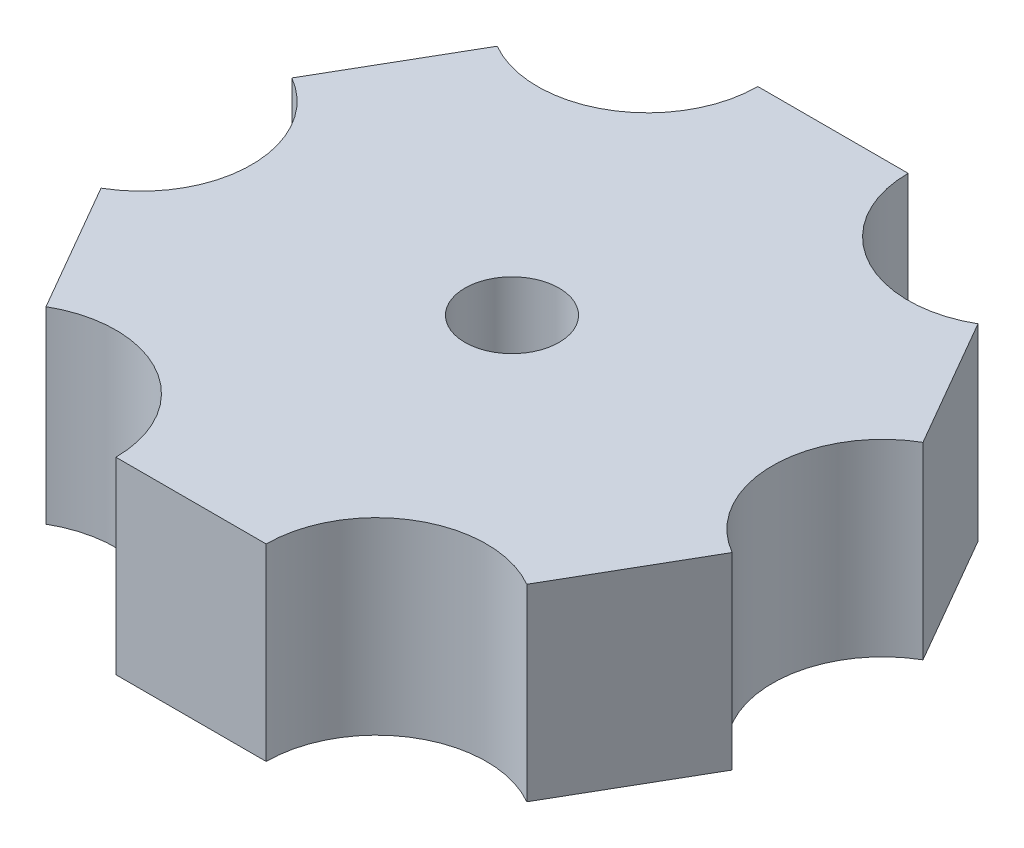
ISO-10303-21;
HEADER;
FILE_DESCRIPTION(('STEP AP214'),'2;1');
FILE_NAME('part.step','',(''),(''),'','','');
FILE_SCHEMA(('AUTOMOTIVE_DESIGN { 1 0 10303 214 1 1 1 1 }'));
ENDSEC;
DATA;
#1=APPLICATION_CONTEXT('core data for automotive mechanical design processes');
#2=APPLICATION_PROTOCOL_DEFINITION('international standard','automotive_design',2000,#1);
#3=PRODUCT_CONTEXT('',#1,'mechanical');
#4=PRODUCT('Part','Part','',(#3));
#5=PRODUCT_RELATED_PRODUCT_CATEGORY('part','',(#4));
#6=PRODUCT_DEFINITION_FORMATION('','',#4);
#7=PRODUCT_DEFINITION_CONTEXT('part definition',#1,'design');
#8=PRODUCT_DEFINITION('design','',#6,#7);
#9=PRODUCT_DEFINITION_SHAPE('','',#8);
#10=(LENGTH_UNIT() NAMED_UNIT(*) SI_UNIT(.MILLI.,.METRE.));
#11=(NAMED_UNIT(*) PLANE_ANGLE_UNIT() SI_UNIT($,.RADIAN.));
#12=(NAMED_UNIT(*) SI_UNIT($,.STERADIAN.) SOLID_ANGLE_UNIT());
#13=UNCERTAINTY_MEASURE_WITH_UNIT(LENGTH_MEASURE(1.E-05),#10,'distance_accuracy_value','');
#14=(GEOMETRIC_REPRESENTATION_CONTEXT(3) GLOBAL_UNCERTAINTY_ASSIGNED_CONTEXT((#13)) GLOBAL_UNIT_ASSIGNED_CONTEXT((#10,
#11,#12)) REPRESENTATION_CONTEXT('',''));
#15=CARTESIAN_POINT('',(0.,0.,0.));
#16=DIRECTION('',(0.,0.,1.));
#17=DIRECTION('',(1.,0.,0.));
#18=AXIS2_PLACEMENT_3D('',#15,#16,#17);
#19=CARTESIAN_POINT('',(-19.6750369171363,20.,-34.0781635812735));
#20=DIRECTION('',(0.,-1.,0.));
#21=DIRECTION('',(0.,0.,-1.));
#22=AXIS2_PLACEMENT_3D('',#19,#20,#21);
#23=PLANE('',#22);
#24=CARTESIAN_POINT('',(-19.6750369171363,20.,-34.0781635812735));
#25=DIRECTION('',(0.,-1.,0.));
#26=DIRECTION('',(0.,0.,-1.));
#27=AXIS2_PLACEMENT_3D('',#24,#25,#26);
#28=CIRCLE('',#27,11.6951392406016);
#29=CARTESIAN_POINT('',(-7.97989767653467,20.,-34.0781635812735));
#30=VERTEX_POINT('',#29);
#31=CARTESIAN_POINT('',(-25.5226065374371,20.,-23.9498758981163));
#32=VERTEX_POINT('',#31);
#33=EDGE_CURVE('E178',#30,#32,#28,.T.);
#34=ORIENTED_EDGE('',*,*,#33,.T.);
#35=DIRECTION('',(-0.500000000000004,0.,0.866025403784436));
#36=VECTOR('',#35,1.);
#37=CARTESIAN_POINT('',(-25.5226065374371,20.,-23.9498758981163));
#38=LINE('',#37,#36);
#39=CARTESIAN_POINT('',(-33.5025042139718,20.,-10.1282876831575));
#40=VERTEX_POINT('',#39);
#41=EDGE_CURVE('E106',#32,#40,#38,.T.);
#42=ORIENTED_EDGE('',*,*,#41,.T.);
#43=CARTESIAN_POINT('',(-39.3500738342727,20.,-2.91693635925226E-13));
#44=DIRECTION('',(0.,-1.,0.));
#45=DIRECTION('',(0.,0.,1.));
#46=AXIS2_PLACEMENT_3D('',#43,#44,#45);
#47=CIRCLE('',#46,11.6951392406016);
#48=CARTESIAN_POINT('',(-33.502504213972,20.,10.128287683157));
#49=VERTEX_POINT('',#48);
#50=EDGE_CURVE('E205',#40,#49,#47,.T.);
#51=ORIENTED_EDGE('',*,*,#50,.T.);
#52=DIRECTION('',(0.499999999999991,0.,0.866025403784444));
#53=VECTOR('',#52,1.);
#54=CARTESIAN_POINT('',(-33.502504213972,20.,10.128287683157));
#55=LINE('',#54,#53);
#56=CARTESIAN_POINT('',(-25.5226065374374,20.,23.9498758981159));
#57=VERTEX_POINT('',#56);
#58=EDGE_CURVE('E224',#49,#57,#55,.T.);
#59=ORIENTED_EDGE('',*,*,#58,.T.);
#60=CARTESIAN_POINT('',(-19.6750369171366,20.,34.0781635812735));
#61=DIRECTION('',(0.,-1.,0.));
#62=DIRECTION('',(0.,0.,1.));
#63=AXIS2_PLACEMENT_3D('',#60,#61,#62);
#64=CIRCLE('',#63,11.6951392406019);
#65=CARTESIAN_POINT('',(-7.97989767653468,20.,34.0781635812735));
#66=VERTEX_POINT('',#65);
#67=EDGE_CURVE('E221',#57,#66,#64,.T.);
#68=ORIENTED_EDGE('',*,*,#67,.T.);
#69=DIRECTION('',(1.,0.,0.));
#70=VECTOR('',#69,1.);
#71=CARTESIAN_POINT('',(7.97989767653467,20.,34.0781635812735));
#72=LINE('',#71,#70);
#73=CARTESIAN_POINT('',(7.97989767653467,20.,34.0781635812735));
#74=VERTEX_POINT('',#73);
#75=EDGE_CURVE('E223',#66,#74,#72,.T.);
#76=ORIENTED_EDGE('',*,*,#75,.T.);
#77=CARTESIAN_POINT('',(19.6750369171366,20.,34.0781635812735));
#78=DIRECTION('',(0.,-1.,0.));
#79=DIRECTION('',(0.,0.,-1.));
#80=AXIS2_PLACEMENT_3D('',#77,#78,#79);
#81=CIRCLE('',#80,11.6951392406019);
#82=CARTESIAN_POINT('',(25.5226065374374,20.,23.949875898116));
#83=VERTEX_POINT('',#82);
#84=EDGE_CURVE('E226',#74,#83,#81,.T.);
#85=ORIENTED_EDGE('',*,*,#84,.T.);
#86=DIRECTION('',(0.499999999999991,0.,-0.866025403784444));
#87=VECTOR('',#86,1.);
#88=CARTESIAN_POINT('',(33.502504213972,20.,10.128287683157));
#89=LINE('',#88,#87);
#90=CARTESIAN_POINT('',(33.502504213972,20.,10.128287683157));
#91=VERTEX_POINT('',#90);
#92=EDGE_CURVE('E232',#83,#91,#89,.T.);
#93=ORIENTED_EDGE('',*,*,#92,.T.);
#94=CARTESIAN_POINT('',(39.3500738342727,20.,-2.82055647531755E-13));
#95=DIRECTION('',(0.,-1.,0.));
#96=DIRECTION('',(0.,0.,-1.));
#97=AXIS2_PLACEMENT_3D('',#94,#95,#96);
#98=CIRCLE('',#97,11.6951392406016);
#99=CARTESIAN_POINT('',(33.5025042139718,20.,-10.1282876831575));
#100=VERTEX_POINT('',#99);
#101=EDGE_CURVE('E137',#91,#100,#98,.T.);
#102=ORIENTED_EDGE('',*,*,#101,.T.);
#103=DIRECTION('',(-0.500000000000004,0.,-0.866025403784436));
#104=VECTOR('',#103,1.);
#105=CARTESIAN_POINT('',(25.5226065374371,20.,-23.9498758981163));
#106=LINE('',#105,#104);
#107=CARTESIAN_POINT('',(25.5226065374371,20.,-23.9498758981163));
#108=VERTEX_POINT('',#107);
#109=EDGE_CURVE('E131',#100,#108,#106,.T.);
#110=ORIENTED_EDGE('',*,*,#109,.T.);
#111=CARTESIAN_POINT('',(19.6750369171363,20.,-34.0781635812735));
#112=DIRECTION('',(0.,-1.,0.));
#113=DIRECTION('',(0.,0.,1.));
#114=AXIS2_PLACEMENT_3D('',#111,#112,#113);
#115=CIRCLE('',#114,11.6951392406016);
#116=CARTESIAN_POINT('',(7.97989767653468,20.,-34.0781635812735));
#117=VERTEX_POINT('',#116);
#118=EDGE_CURVE('E135',#108,#117,#115,.T.);
#119=ORIENTED_EDGE('',*,*,#118,.T.);
#120=DIRECTION('',(-1.,0.,0.));
#121=VECTOR('',#120,1.);
#122=CARTESIAN_POINT('',(-7.97989767653467,20.,-34.0781635812735));
#123=LINE('',#122,#121);
#124=EDGE_CURVE('E51',#117,#30,#123,.T.);
#125=ORIENTED_EDGE('',*,*,#124,.T.);
#126=EDGE_LOOP('',(#34,#42,#51,#59,#68,#76,#85,#93,#102,#110,#119,#125));
#127=FACE_BOUND('',#126,.T.);
#128=CARTESIAN_POINT('',(0.,20.,0.));
#129=DIRECTION('',(0.,1.,0.));
#130=DIRECTION('',(0.,0.,1.));
#131=AXIS2_PLACEMENT_3D('',#128,#129,#130);
#132=CIRCLE('',#131,5.);
#133=CARTESIAN_POINT('',(0.,20.,5.));
#134=VERTEX_POINT('',#133);
#135=EDGE_CURVE('E159',#134,#134,#132,.T.);
#136=ORIENTED_EDGE('',*,*,#135,.F.);
#137=EDGE_LOOP('',(#136));
#138=FACE_BOUND('',#137,.T.);
#139=ADVANCED_FACE('F34',(#127,#138),#23,.F.);
#140=CARTESIAN_POINT('',(-19.6750369171363,0.,-34.0781635812735));
#141=DIRECTION('',(0.,-1.,0.));
#142=DIRECTION('',(0.,0.,-1.));
#143=AXIS2_PLACEMENT_3D('',#140,#141,#142);
#144=PLANE('',#143);
#145=CARTESIAN_POINT('',(-19.6750369171363,0.,-34.0781635812735));
#146=DIRECTION('',(0.,-1.,0.));
#147=DIRECTION('',(0.,0.,-1.));
#148=AXIS2_PLACEMENT_3D('',#145,#146,#147);
#149=CIRCLE('',#148,11.6951392406016);
#150=CARTESIAN_POINT('',(-7.97989767653467,0.,-34.0781635812735));
#151=VERTEX_POINT('',#150);
#152=CARTESIAN_POINT('',(-25.5226065374371,0.,-23.9498758981163));
#153=VERTEX_POINT('',#152);
#154=EDGE_CURVE('E155',#151,#153,#149,.T.);
#155=ORIENTED_EDGE('',*,*,#154,.F.);
#156=DIRECTION('',(-1.,0.,0.));
#157=VECTOR('',#156,1.);
#158=CARTESIAN_POINT('',(-7.97989767653467,0.,-34.0781635812735));
#159=LINE('',#158,#157);
#160=CARTESIAN_POINT('',(7.97989767653468,0.,-34.0781635812735));
#161=VERTEX_POINT('',#160);
#162=EDGE_CURVE('E98',#161,#151,#159,.T.);
#163=ORIENTED_EDGE('',*,*,#162,.F.);
#164=CARTESIAN_POINT('',(19.6750369171363,0.,-34.0781635812735));
#165=DIRECTION('',(0.,-1.,0.));
#166=DIRECTION('',(0.,0.,1.));
#167=AXIS2_PLACEMENT_3D('',#164,#165,#166);
#168=CIRCLE('',#167,11.6951392406016);
#169=CARTESIAN_POINT('',(25.5226065374371,0.,-23.9498758981163));
#170=VERTEX_POINT('',#169);
#171=EDGE_CURVE('E92',#170,#161,#168,.T.);
#172=ORIENTED_EDGE('',*,*,#171,.F.);
#173=DIRECTION('',(-0.500000000000004,0.,-0.866025403784436));
#174=VECTOR('',#173,1.);
#175=CARTESIAN_POINT('',(25.5226065374371,0.,-23.9498758981163));
#176=LINE('',#175,#174);
#177=CARTESIAN_POINT('',(33.5025042139718,0.,-10.1282876831575));
#178=VERTEX_POINT('',#177);
#179=EDGE_CURVE('E145',#178,#170,#176,.T.);
#180=ORIENTED_EDGE('',*,*,#179,.F.);
#181=CARTESIAN_POINT('',(39.3500738342727,0.,-2.82055647531755E-13));
#182=DIRECTION('',(0.,-1.,0.));
#183=DIRECTION('',(0.,0.,-1.));
#184=AXIS2_PLACEMENT_3D('',#181,#182,#183);
#185=CIRCLE('',#184,11.6951392406016);
#186=CARTESIAN_POINT('',(33.502504213972,0.,10.128287683157));
#187=VERTEX_POINT('',#186);
#188=EDGE_CURVE('E173',#187,#178,#185,.T.);
#189=ORIENTED_EDGE('',*,*,#188,.F.);
#190=DIRECTION('',(0.499999999999991,0.,-0.866025403784444));
#191=VECTOR('',#190,1.);
#192=CARTESIAN_POINT('',(33.502504213972,0.,10.128287683157));
#193=LINE('',#192,#191);
#194=CARTESIAN_POINT('',(25.5226065374374,0.,23.949875898116));
#195=VERTEX_POINT('',#194);
#196=EDGE_CURVE('E171',#195,#187,#193,.T.);
#197=ORIENTED_EDGE('',*,*,#196,.F.);
#198=CARTESIAN_POINT('',(19.6750369171366,0.,34.0781635812735));
#199=DIRECTION('',(0.,-1.,0.));
#200=DIRECTION('',(0.,0.,-1.));
#201=AXIS2_PLACEMENT_3D('',#198,#199,#200);
#202=CIRCLE('',#201,11.6951392406019);
#203=CARTESIAN_POINT('',(7.97989767653467,0.,34.0781635812735));
#204=VERTEX_POINT('',#203);
#205=EDGE_CURVE('E169',#204,#195,#202,.T.);
#206=ORIENTED_EDGE('',*,*,#205,.F.);
#207=DIRECTION('',(1.,0.,0.));
#208=VECTOR('',#207,1.);
#209=CARTESIAN_POINT('',(7.97989767653467,0.,34.0781635812735));
#210=LINE('',#209,#208);
#211=CARTESIAN_POINT('',(-7.97989767653468,0.,34.0781635812735));
#212=VERTEX_POINT('',#211);
#213=EDGE_CURVE('E167',#212,#204,#210,.T.);
#214=ORIENTED_EDGE('',*,*,#213,.F.);
#215=CARTESIAN_POINT('',(-19.6750369171366,0.,34.0781635812735));
#216=DIRECTION('',(0.,-1.,0.));
#217=DIRECTION('',(0.,0.,1.));
#218=AXIS2_PLACEMENT_3D('',#215,#216,#217);
#219=CIRCLE('',#218,11.6951392406019);
#220=CARTESIAN_POINT('',(-25.5226065374374,0.,23.9498758981159));
#221=VERTEX_POINT('',#220);
#222=EDGE_CURVE('E165',#221,#212,#219,.T.);
#223=ORIENTED_EDGE('',*,*,#222,.F.);
#224=DIRECTION('',(0.499999999999991,0.,0.866025403784444));
#225=VECTOR('',#224,1.);
#226=CARTESIAN_POINT('',(-33.502504213972,0.,10.128287683157));
#227=LINE('',#226,#225);
#228=CARTESIAN_POINT('',(-33.502504213972,0.,10.128287683157));
#229=VERTEX_POINT('',#228);
#230=EDGE_CURVE('E163',#229,#221,#227,.T.);
#231=ORIENTED_EDGE('',*,*,#230,.F.);
#232=CARTESIAN_POINT('',(-39.3500738342727,0.,-2.91693635925226E-13));
#233=DIRECTION('',(0.,-1.,0.));
#234=DIRECTION('',(0.,0.,1.));
#235=AXIS2_PLACEMENT_3D('',#232,#233,#234);
#236=CIRCLE('',#235,11.6951392406016);
#237=CARTESIAN_POINT('',(-33.5025042139718,0.,-10.1282876831575));
#238=VERTEX_POINT('',#237);
#239=EDGE_CURVE('E161',#238,#229,#236,.T.);
#240=ORIENTED_EDGE('',*,*,#239,.F.);
#241=DIRECTION('',(-0.500000000000004,0.,0.866025403784436));
#242=VECTOR('',#241,1.);
#243=CARTESIAN_POINT('',(-25.5226065374371,0.,-23.9498758981163));
#244=LINE('',#243,#242);
#245=EDGE_CURVE('E158',#153,#238,#244,.T.);
#246=ORIENTED_EDGE('',*,*,#245,.F.);
#247=EDGE_LOOP('',(#155,#163,#172,#180,#189,#197,#206,#214,#223,#231,#240,#246));
#248=FACE_BOUND('',#247,.T.);
#249=CARTESIAN_POINT('',(0.,0.,0.));
#250=DIRECTION('',(0.,1.,0.));
#251=DIRECTION('',(0.,0.,1.));
#252=AXIS2_PLACEMENT_3D('',#249,#250,#251);
#253=CIRCLE('',#252,5.);
#254=CARTESIAN_POINT('',(0.,0.,5.));
#255=VERTEX_POINT('',#254);
#256=EDGE_CURVE('E379',#255,#255,#253,.T.);
#257=ORIENTED_EDGE('',*,*,#256,.T.);
#258=EDGE_LOOP('',(#257));
#259=FACE_BOUND('',#258,.T.);
#260=ADVANCED_FACE('F209',(#248,#259),#144,.T.);
#261=CARTESIAN_POINT('',(-19.6750369171363,20.,-34.0781635812735));
#262=DIRECTION('',(0.,-1.,0.));
#263=DIRECTION('',(0.,0.,-1.));
#264=AXIS2_PLACEMENT_3D('',#261,#262,#263);
#265=CYLINDRICAL_SURFACE('',#264,11.6951392406016);
#266=ORIENTED_EDGE('',*,*,#154,.T.);
#267=DIRECTION('',(0.,-1.,0.));
#268=VECTOR('',#267,1.);
#269=CARTESIAN_POINT('',(-25.5226065374371,20.,-23.9498758981163));
#270=LINE('',#269,#268);
#271=EDGE_CURVE('E11',#32,#153,#270,.T.);
#272=ORIENTED_EDGE('',*,*,#271,.F.);
#273=ORIENTED_EDGE('',*,*,#33,.F.);
#274=DIRECTION('',(0.,-1.,0.));
#275=VECTOR('',#274,1.);
#276=CARTESIAN_POINT('',(-7.97989767653467,20.,-34.0781635812735));
#277=LINE('',#276,#275);
#278=EDGE_CURVE('E151',#30,#151,#277,.T.);
#279=ORIENTED_EDGE('',*,*,#278,.T.);
#280=EDGE_LOOP('',(#266,#272,#273,#279));
#281=FACE_BOUND('',#280,.T.);
#282=ADVANCED_FACE('F36',(#281),#265,.F.);
#283=CARTESIAN_POINT('',(-25.5226065374371,20.,-23.9498758981163));
#284=DIRECTION('',(0.866025403784436,0.,0.500000000000004));
#285=DIRECTION('',(0.500000000000004,0.,-0.866025403784436));
#286=AXIS2_PLACEMENT_3D('',#283,#284,#285);
#287=PLANE('',#286);
#288=ORIENTED_EDGE('',*,*,#245,.T.);
#289=DIRECTION('',(0.,-1.,0.));
#290=VECTOR('',#289,1.);
#291=CARTESIAN_POINT('',(-33.5025042139718,20.,-10.1282876831575));
#292=LINE('',#291,#290);
#293=EDGE_CURVE('E43',#40,#238,#292,.T.);
#294=ORIENTED_EDGE('',*,*,#293,.F.);
#295=ORIENTED_EDGE('',*,*,#41,.F.);
#296=ORIENTED_EDGE('',*,*,#271,.T.);
#297=EDGE_LOOP('',(#288,#294,#295,#296));
#298=FACE_BOUND('',#297,.T.);
#299=ADVANCED_FACE('F266',(#298),#287,.F.);
#300=CARTESIAN_POINT('',(-39.3500738342727,20.,-2.91693635925226E-13));
#301=DIRECTION('',(0.,-1.,0.));
#302=DIRECTION('',(0.,0.,-1.));
#303=AXIS2_PLACEMENT_3D('',#300,#301,#302);
#304=CYLINDRICAL_SURFACE('',#303,11.6951392406016);
#305=ORIENTED_EDGE('',*,*,#239,.T.);
#306=DIRECTION('',(0.,-1.,0.));
#307=VECTOR('',#306,1.);
#308=CARTESIAN_POINT('',(-33.502504213972,20.,10.128287683157));
#309=LINE('',#308,#307);
#310=EDGE_CURVE('E197',#49,#229,#309,.T.);
#311=ORIENTED_EDGE('',*,*,#310,.F.);
#312=ORIENTED_EDGE('',*,*,#50,.F.);
#313=ORIENTED_EDGE('',*,*,#293,.T.);
#314=EDGE_LOOP('',(#305,#311,#312,#313));
#315=FACE_BOUND('',#314,.T.);
#316=ADVANCED_FACE('F203',(#315),#304,.F.);
#317=CARTESIAN_POINT('',(-33.502504213972,20.,10.128287683157));
#318=DIRECTION('',(0.866025403784444,0.,-0.499999999999991));
#319=DIRECTION('',(-0.499999999999991,0.,-0.866025403784444));
#320=AXIS2_PLACEMENT_3D('',#317,#318,#319);
#321=PLANE('',#320);
#322=ORIENTED_EDGE('',*,*,#230,.T.);
#323=DIRECTION('',(0.,-1.,0.));
#324=VECTOR('',#323,1.);
#325=CARTESIAN_POINT('',(-25.5226065374374,20.,23.9498758981159));
#326=LINE('',#325,#324);
#327=EDGE_CURVE('E194',#57,#221,#326,.T.);
#328=ORIENTED_EDGE('',*,*,#327,.F.);
#329=ORIENTED_EDGE('',*,*,#58,.F.);
#330=ORIENTED_EDGE('',*,*,#310,.T.);
#331=EDGE_LOOP('',(#322,#328,#329,#330));
#332=FACE_BOUND('',#331,.T.);
#333=ADVANCED_FACE('F215',(#332),#321,.F.);
#334=CARTESIAN_POINT('',(-19.6750369171366,20.,34.0781635812735));
#335=DIRECTION('',(0.,-1.,0.));
#336=DIRECTION('',(0.,0.,-1.));
#337=AXIS2_PLACEMENT_3D('',#334,#335,#336);
#338=CYLINDRICAL_SURFACE('',#337,11.6951392406019);
#339=ORIENTED_EDGE('',*,*,#222,.T.);
#340=DIRECTION('',(0.,-1.,0.));
#341=VECTOR('',#340,1.);
#342=CARTESIAN_POINT('',(-7.97989767653468,20.,34.0781635812735));
#343=LINE('',#342,#341);
#344=EDGE_CURVE('E191',#66,#212,#343,.T.);
#345=ORIENTED_EDGE('',*,*,#344,.F.);
#346=ORIENTED_EDGE('',*,*,#67,.F.);
#347=ORIENTED_EDGE('',*,*,#327,.T.);
#348=EDGE_LOOP('',(#339,#345,#346,#347));
#349=FACE_BOUND('',#348,.T.);
#350=ADVANCED_FACE('F219',(#349),#338,.F.);
#351=CARTESIAN_POINT('',(7.97989767653467,20.,34.0781635812735));
#352=DIRECTION('',(0.,0.,-1.));
#353=DIRECTION('',(-1.,0.,0.));
#354=AXIS2_PLACEMENT_3D('',#351,#352,#353);
#355=PLANE('',#354);
#356=ORIENTED_EDGE('',*,*,#213,.T.);
#357=DIRECTION('',(0.,-1.,0.));
#358=VECTOR('',#357,1.);
#359=CARTESIAN_POINT('',(7.97989767653467,20.,34.0781635812735));
#360=LINE('',#359,#358);
#361=EDGE_CURVE('E188',#74,#204,#360,.T.);
#362=ORIENTED_EDGE('',*,*,#361,.F.);
#363=ORIENTED_EDGE('',*,*,#75,.F.);
#364=ORIENTED_EDGE('',*,*,#344,.T.);
#365=EDGE_LOOP('',(#356,#362,#363,#364));
#366=FACE_BOUND('',#365,.T.);
#367=ADVANCED_FACE('F279',(#366),#355,.F.);
#368=CARTESIAN_POINT('',(19.6750369171366,20.,34.0781635812735));
#369=DIRECTION('',(0.,-1.,0.));
#370=DIRECTION('',(0.,0.,-1.));
#371=AXIS2_PLACEMENT_3D('',#368,#369,#370);
#372=CYLINDRICAL_SURFACE('',#371,11.6951392406019);
#373=ORIENTED_EDGE('',*,*,#205,.T.);
#374=DIRECTION('',(0.,-1.,0.));
#375=VECTOR('',#374,1.);
#376=CARTESIAN_POINT('',(25.5226065374374,20.,23.949875898116));
#377=LINE('',#376,#375);
#378=EDGE_CURVE('E185',#83,#195,#377,.T.);
#379=ORIENTED_EDGE('',*,*,#378,.F.);
#380=ORIENTED_EDGE('',*,*,#84,.F.);
#381=ORIENTED_EDGE('',*,*,#361,.T.);
#382=EDGE_LOOP('',(#373,#379,#380,#381));
#383=FACE_BOUND('',#382,.T.);
#384=ADVANCED_FACE('F282',(#383),#372,.F.);
#385=CARTESIAN_POINT('',(33.502504213972,20.,10.128287683157));
#386=DIRECTION('',(-0.866025403784444,0.,-0.499999999999991));
#387=DIRECTION('',(-0.499999999999991,0.,0.866025403784444));
#388=AXIS2_PLACEMENT_3D('',#385,#386,#387);
#389=PLANE('',#388);
#390=ORIENTED_EDGE('',*,*,#196,.T.);
#391=DIRECTION('',(0.,-1.,0.));
#392=VECTOR('',#391,1.);
#393=CARTESIAN_POINT('',(33.502504213972,20.,10.128287683157));
#394=LINE('',#393,#392);
#395=EDGE_CURVE('E182',#91,#187,#394,.T.);
#396=ORIENTED_EDGE('',*,*,#395,.F.);
#397=ORIENTED_EDGE('',*,*,#92,.F.);
#398=ORIENTED_EDGE('',*,*,#378,.T.);
#399=EDGE_LOOP('',(#390,#396,#397,#398));
#400=FACE_BOUND('',#399,.T.);
#401=ADVANCED_FACE('F238',(#400),#389,.F.);
#402=CARTESIAN_POINT('',(39.3500738342727,20.,-2.82055647531755E-13));
#403=DIRECTION('',(0.,-1.,0.));
#404=DIRECTION('',(0.,0.,-1.));
#405=AXIS2_PLACEMENT_3D('',#402,#403,#404);
#406=CYLINDRICAL_SURFACE('',#405,11.6951392406016);
#407=ORIENTED_EDGE('',*,*,#188,.T.);
#408=DIRECTION('',(0.,-1.,0.));
#409=VECTOR('',#408,1.);
#410=CARTESIAN_POINT('',(33.5025042139718,20.,-10.1282876831575));
#411=LINE('',#410,#409);
#412=EDGE_CURVE('E146',#100,#178,#411,.T.);
#413=ORIENTED_EDGE('',*,*,#412,.F.);
#414=ORIENTED_EDGE('',*,*,#101,.F.);
#415=ORIENTED_EDGE('',*,*,#395,.T.);
#416=EDGE_LOOP('',(#407,#413,#414,#415));
#417=FACE_BOUND('',#416,.T.);
#418=ADVANCED_FACE('F242',(#417),#406,.F.);
#419=CARTESIAN_POINT('',(25.5226065374371,20.,-23.9498758981163));
#420=DIRECTION('',(-0.866025403784436,0.,0.500000000000004));
#421=DIRECTION('',(0.500000000000004,0.,0.866025403784436));
#422=AXIS2_PLACEMENT_3D('',#419,#420,#421);
#423=PLANE('',#422);
#424=ORIENTED_EDGE('',*,*,#179,.T.);
#425=DIRECTION('',(0.,-1.,0.));
#426=VECTOR('',#425,1.);
#427=CARTESIAN_POINT('',(25.5226065374371,20.,-23.9498758981163));
#428=LINE('',#427,#426);
#429=EDGE_CURVE('E142',#108,#170,#428,.T.);
#430=ORIENTED_EDGE('',*,*,#429,.F.);
#431=ORIENTED_EDGE('',*,*,#109,.F.);
#432=ORIENTED_EDGE('',*,*,#412,.T.);
#433=EDGE_LOOP('',(#424,#430,#431,#432));
#434=FACE_BOUND('',#433,.T.);
#435=ADVANCED_FACE('F143',(#434),#423,.F.);
#436=CARTESIAN_POINT('',(19.6750369171363,20.,-34.0781635812735));
#437=DIRECTION('',(0.,-1.,0.));
#438=DIRECTION('',(0.,0.,-1.));
#439=AXIS2_PLACEMENT_3D('',#436,#437,#438);
#440=CYLINDRICAL_SURFACE('',#439,11.6951392406016);
#441=ORIENTED_EDGE('',*,*,#171,.T.);
#442=DIRECTION('',(0.,-1.,0.));
#443=VECTOR('',#442,1.);
#444=CARTESIAN_POINT('',(7.97989767653468,20.,-34.0781635812735));
#445=LINE('',#444,#443);
#446=EDGE_CURVE('E147',#117,#161,#445,.T.);
#447=ORIENTED_EDGE('',*,*,#446,.F.);
#448=ORIENTED_EDGE('',*,*,#118,.F.);
#449=ORIENTED_EDGE('',*,*,#429,.T.);
#450=EDGE_LOOP('',(#441,#447,#448,#449));
#451=FACE_BOUND('',#450,.T.);
#452=ADVANCED_FACE('F149',(#451),#440,.F.);
#453=CARTESIAN_POINT('',(-7.97989767653467,20.,-34.0781635812735));
#454=DIRECTION('',(0.,0.,1.));
#455=DIRECTION('',(1.,0.,0.));
#456=AXIS2_PLACEMENT_3D('',#453,#454,#455);
#457=PLANE('',#456);
#458=ORIENTED_EDGE('',*,*,#162,.T.);
#459=ORIENTED_EDGE('',*,*,#278,.F.);
#460=ORIENTED_EDGE('',*,*,#124,.F.);
#461=ORIENTED_EDGE('',*,*,#446,.T.);
#462=EDGE_LOOP('',(#458,#459,#460,#461));
#463=FACE_BOUND('',#462,.T.);
#464=ADVANCED_FACE('F246',(#463),#457,.F.);
#465=CARTESIAN_POINT('',(0.,20.,0.));
#466=DIRECTION('',(0.,-1.,0.));
#467=DIRECTION('',(0.,0.,-1.));
#468=AXIS2_PLACEMENT_3D('',#465,#466,#467);
#469=CYLINDRICAL_SURFACE('',#468,5.);
#470=ORIENTED_EDGE('',*,*,#135,.T.);
#471=EDGE_LOOP('',(#470));
#472=FACE_BOUND('',#471,.T.);
#473=ORIENTED_EDGE('',*,*,#256,.F.);
#474=EDGE_LOOP('',(#473));
#475=FACE_BOUND('',#474,.T.);
#476=ADVANCED_FACE('F248',(#472,#475),#469,.F.);
#477=CLOSED_SHELL('',(#139,#260,#282,#299,#316,#333,#350,#367,#384,#401,#418,#435,#452,#464,#476));
#478=MANIFOLD_SOLID_BREP('B2',#477);
#479=ADVANCED_BREP_SHAPE_REPRESENTATION('',(#18,#478),#14);
#480=SHAPE_DEFINITION_REPRESENTATION(#9,#479);
ENDSEC;
END-ISO-10303-21;
